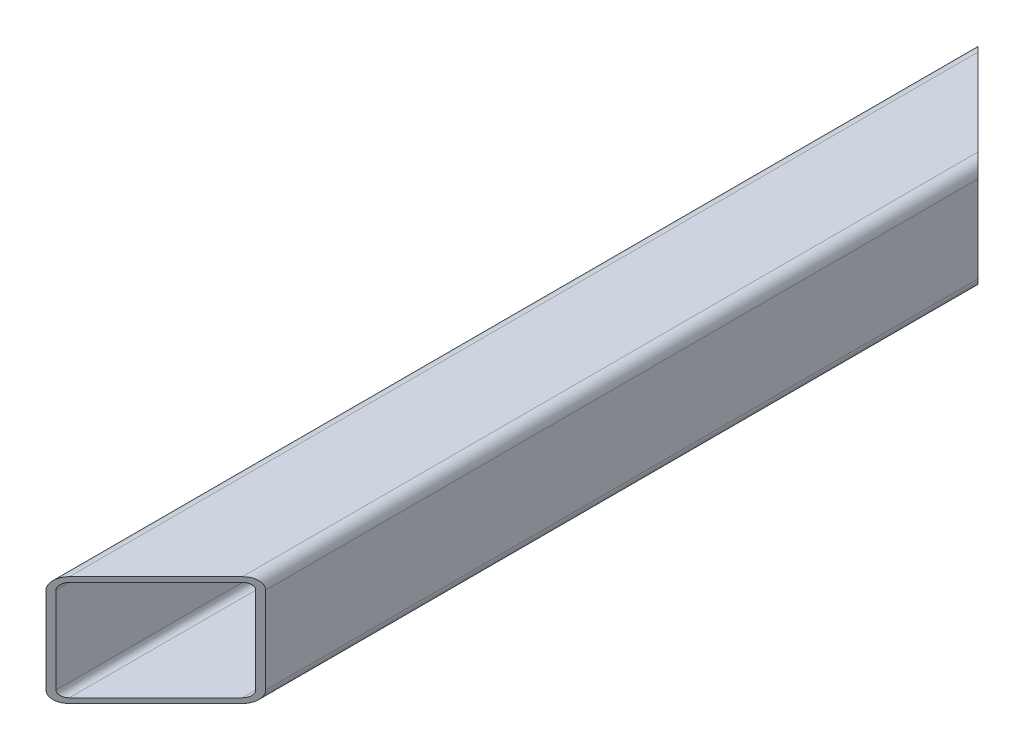
ISO-10303-21;
HEADER;
FILE_DESCRIPTION(('STEP AP214'),'2;1');
FILE_NAME('part.step','',(''),(''),'','','');
FILE_SCHEMA(('AUTOMOTIVE_DESIGN { 1 0 10303 214 1 1 1 1 }'));
ENDSEC;
DATA;
#1=APPLICATION_CONTEXT('core data for automotive mechanical design processes');
#2=APPLICATION_PROTOCOL_DEFINITION('international standard','automotive_design',2000,#1);
#3=PRODUCT_CONTEXT('',#1,'mechanical');
#4=PRODUCT('Part','Part','',(#3));
#5=PRODUCT_RELATED_PRODUCT_CATEGORY('part','',(#4));
#6=PRODUCT_DEFINITION_FORMATION('','',#4);
#7=PRODUCT_DEFINITION_CONTEXT('part definition',#1,'design');
#8=PRODUCT_DEFINITION('design','',#6,#7);
#9=PRODUCT_DEFINITION_SHAPE('','',#8);
#10=(LENGTH_UNIT() NAMED_UNIT(*) SI_UNIT(.MILLI.,.METRE.));
#11=(NAMED_UNIT(*) PLANE_ANGLE_UNIT() SI_UNIT($,.RADIAN.));
#12=(NAMED_UNIT(*) SI_UNIT($,.STERADIAN.) SOLID_ANGLE_UNIT());
#13=UNCERTAINTY_MEASURE_WITH_UNIT(LENGTH_MEASURE(1.E-05),#10,'distance_accuracy_value','');
#14=(GEOMETRIC_REPRESENTATION_CONTEXT(3) GLOBAL_UNCERTAINTY_ASSIGNED_CONTEXT((#13)) GLOBAL_UNIT_ASSIGNED_CONTEXT((#10,
#11,#12)) REPRESENTATION_CONTEXT('',''));
#15=CARTESIAN_POINT('',(0.,0.,0.));
#16=DIRECTION('',(0.,0.,1.));
#17=DIRECTION('',(1.,0.,0.));
#18=AXIS2_PLACEMENT_3D('',#15,#16,#17);
#19=CARTESIAN_POINT('',(28.,2.,280.));
#20=DIRECTION('',(0.,0.,-1.));
#21=DIRECTION('',(-1.,0.,0.));
#22=AXIS2_PLACEMENT_3D('',#19,#20,#21);
#23=CYLINDRICAL_SURFACE('',#22,3.5);
#24=DIRECTION('',(0.,0.,-1.));
#25=VECTOR('',#24,1.);
#26=CARTESIAN_POINT('',(31.5,2.00000000000001,280.));
#27=LINE('',#26,#25);
#28=CARTESIAN_POINT('',(31.5,2.00000000000001,247.));
#29=VERTEX_POINT('',#28);
#30=CARTESIAN_POINT('',(31.5,2.00000000000001,33.));
#31=VERTEX_POINT('',#30);
#32=EDGE_CURVE('E219',#29,#31,#27,.T.);
#33=ORIENTED_EDGE('',*,*,#32,.F.);
#34=CARTESIAN_POINT('',(28.,2.,250.5));
#35=DIRECTION('',(-0.707106781186547,0.,-0.707106781186547));
#36=DIRECTION('',(0.707106781186548,0.,-0.707106781186548));
#37=AXIS2_PLACEMENT_3D('',#34,#35,#36);
#38=ELLIPSE('',#37,4.94974746830583,3.5);
#39=CARTESIAN_POINT('',(28.,-1.5,250.5));
#40=VERTEX_POINT('',#39);
#41=EDGE_CURVE('E201',#29,#40,#38,.T.);
#42=ORIENTED_EDGE('',*,*,#41,.T.);
#43=DIRECTION('',(0.,0.,-1.));
#44=VECTOR('',#43,1.);
#45=CARTESIAN_POINT('',(28.,-1.5,280.));
#46=LINE('',#45,#44);
#47=CARTESIAN_POINT('',(28.,-1.5,29.5));
#48=VERTEX_POINT('',#47);
#49=EDGE_CURVE('E280',#40,#48,#46,.T.);
#50=ORIENTED_EDGE('',*,*,#49,.T.);
#51=CARTESIAN_POINT('',(28.,2.,29.5));
#52=DIRECTION('',(-0.707106781186547,0.,0.707106781186547));
#53=DIRECTION('',(-0.707106781186548,0.,-0.707106781186548));
#54=AXIS2_PLACEMENT_3D('',#51,#52,#53);
#55=ELLIPSE('',#54,4.94974746830583,3.5);
#56=EDGE_CURVE('E260',#48,#31,#55,.T.);
#57=ORIENTED_EDGE('',*,*,#56,.T.);
#58=EDGE_LOOP('',(#33,#42,#50,#57));
#59=FACE_BOUND('',#58,.T.);
#60=ADVANCED_FACE('F82',(#59),#23,.T.);
#61=CARTESIAN_POINT('',(31.5,2.00000000000001,280.));
#62=DIRECTION('',(-1.,0.,0.));
#63=DIRECTION('',(0.,0.,1.));
#64=AXIS2_PLACEMENT_3D('',#61,#62,#63);
#65=PLANE('',#64);
#66=DIRECTION('',(0.,0.,-1.));
#67=VECTOR('',#66,1.);
#68=CARTESIAN_POINT('',(31.5,28.,280.));
#69=LINE('',#68,#67);
#70=CARTESIAN_POINT('',(31.5,28.,247.));
#71=VERTEX_POINT('',#70);
#72=CARTESIAN_POINT('',(31.5,28.,33.));
#73=VERTEX_POINT('',#72);
#74=EDGE_CURVE('E217',#71,#73,#69,.T.);
#75=ORIENTED_EDGE('',*,*,#74,.F.);
#76=DIRECTION('',(0.,1.,0.));
#77=VECTOR('',#76,1.);
#78=CARTESIAN_POINT('',(31.5,-1.5,247.));
#79=LINE('',#78,#77);
#80=EDGE_CURVE('E197',#29,#71,#79,.T.);
#81=ORIENTED_EDGE('',*,*,#80,.F.);
#82=ORIENTED_EDGE('',*,*,#32,.T.);
#83=DIRECTION('',(0.,1.,0.));
#84=VECTOR('',#83,1.);
#85=CARTESIAN_POINT('',(31.5,-1.5,33.));
#86=LINE('',#85,#84);
#87=EDGE_CURVE('E302',#31,#73,#86,.T.);
#88=ORIENTED_EDGE('',*,*,#87,.T.);
#89=EDGE_LOOP('',(#75,#81,#82,#88));
#90=FACE_BOUND('',#89,.T.);
#91=ADVANCED_FACE('F368',(#90),#65,.F.);
#92=CARTESIAN_POINT('',(28.,28.,280.));
#93=DIRECTION('',(0.,0.,-1.));
#94=DIRECTION('',(-1.,0.,0.));
#95=AXIS2_PLACEMENT_3D('',#92,#93,#94);
#96=CYLINDRICAL_SURFACE('',#95,3.5);
#97=DIRECTION('',(0.,0.,-1.));
#98=VECTOR('',#97,1.);
#99=CARTESIAN_POINT('',(28.,31.5,280.));
#100=LINE('',#99,#98);
#101=CARTESIAN_POINT('',(28.,31.5,250.5));
#102=VERTEX_POINT('',#101);
#103=CARTESIAN_POINT('',(28.,31.5,29.5));
#104=VERTEX_POINT('',#103);
#105=EDGE_CURVE('E208',#102,#104,#100,.T.);
#106=ORIENTED_EDGE('',*,*,#105,.F.);
#107=CARTESIAN_POINT('',(28.,28.,250.5));
#108=DIRECTION('',(-0.707106781186547,0.,-0.707106781186547));
#109=DIRECTION('',(0.707106781186548,0.,-0.707106781186548));
#110=AXIS2_PLACEMENT_3D('',#107,#108,#109);
#111=ELLIPSE('',#110,4.94974746830584,3.5);
#112=EDGE_CURVE('E191',#102,#71,#111,.T.);
#113=ORIENTED_EDGE('',*,*,#112,.T.);
#114=ORIENTED_EDGE('',*,*,#74,.T.);
#115=CARTESIAN_POINT('',(28.,28.,29.5));
#116=DIRECTION('',(-0.707106781186547,0.,0.707106781186547));
#117=DIRECTION('',(-0.707106781186548,0.,-0.707106781186548));
#118=AXIS2_PLACEMENT_3D('',#115,#116,#117);
#119=ELLIPSE('',#118,4.94974746830584,3.5);
#120=EDGE_CURVE('E216',#73,#104,#119,.T.);
#121=ORIENTED_EDGE('',*,*,#120,.T.);
#122=EDGE_LOOP('',(#106,#113,#114,#121));
#123=FACE_BOUND('',#122,.T.);
#124=ADVANCED_FACE('F214',(#123),#96,.T.);
#125=CARTESIAN_POINT('',(2.00000000000001,31.5,280.));
#126=DIRECTION('',(0.,-1.,0.));
#127=DIRECTION('',(0.,0.,-1.));
#128=AXIS2_PLACEMENT_3D('',#125,#126,#127);
#129=PLANE('',#128);
#130=DIRECTION('',(0.,0.,-1.));
#131=VECTOR('',#130,1.);
#132=CARTESIAN_POINT('',(2.00000000000001,31.5,280.));
#133=LINE('',#132,#131);
#134=CARTESIAN_POINT('',(2.,31.5,276.5));
#135=VERTEX_POINT('',#134);
#136=CARTESIAN_POINT('',(2.,31.5,3.50000000000001));
#137=VERTEX_POINT('',#136);
#138=EDGE_CURVE('E210',#135,#137,#133,.T.);
#139=ORIENTED_EDGE('',*,*,#138,.F.);
#140=DIRECTION('',(-0.707106781186547,0.,0.707106781186547));
#141=VECTOR('',#140,1.);
#142=CARTESIAN_POINT('',(-1.5,31.5,280.));
#143=LINE('',#142,#141);
#144=EDGE_CURVE('E194',#102,#135,#143,.T.);
#145=ORIENTED_EDGE('',*,*,#144,.F.);
#146=ORIENTED_EDGE('',*,*,#105,.T.);
#147=DIRECTION('',(0.707106781186547,0.,0.707106781186547));
#148=VECTOR('',#147,1.);
#149=CARTESIAN_POINT('',(-1.5,31.5,0.));
#150=LINE('',#149,#148);
#151=EDGE_CURVE('E298',#137,#104,#150,.T.);
#152=ORIENTED_EDGE('',*,*,#151,.F.);
#153=EDGE_LOOP('',(#139,#145,#146,#152));
#154=FACE_BOUND('',#153,.T.);
#155=ADVANCED_FACE('F206',(#154),#129,.F.);
#156=CARTESIAN_POINT('',(2.,28.,280.));
#157=DIRECTION('',(0.,0.,-1.));
#158=DIRECTION('',(-1.,0.,0.));
#159=AXIS2_PLACEMENT_3D('',#156,#157,#158);
#160=CYLINDRICAL_SURFACE('',#159,3.5);
#161=DIRECTION('',(0.,0.,-1.));
#162=VECTOR('',#161,1.);
#163=CARTESIAN_POINT('',(-1.5,28.,280.));
#164=LINE('',#163,#162);
#165=CARTESIAN_POINT('',(-1.5,28.,280.));
#166=VERTEX_POINT('',#165);
#167=CARTESIAN_POINT('',(-1.5,28.,0.));
#168=VERTEX_POINT('',#167);
#169=EDGE_CURVE('E221',#166,#168,#164,.T.);
#170=ORIENTED_EDGE('',*,*,#169,.F.);
#171=CARTESIAN_POINT('',(2.,28.,276.5));
#172=DIRECTION('',(-0.707106781186547,0.,-0.707106781186547));
#173=DIRECTION('',(0.707106781186548,0.,-0.707106781186548));
#174=AXIS2_PLACEMENT_3D('',#171,#172,#173);
#175=ELLIPSE('',#174,4.94974746830583,3.5);
#176=EDGE_CURVE('E202',#166,#135,#175,.T.);
#177=ORIENTED_EDGE('',*,*,#176,.T.);
#178=ORIENTED_EDGE('',*,*,#138,.T.);
#179=CARTESIAN_POINT('',(2.,28.,3.5));
#180=DIRECTION('',(-0.707106781186547,0.,0.707106781186547));
#181=DIRECTION('',(-0.707106781186548,0.,-0.707106781186548));
#182=AXIS2_PLACEMENT_3D('',#179,#180,#181);
#183=ELLIPSE('',#182,4.94974746830583,3.5);
#184=EDGE_CURVE('E251',#137,#168,#183,.T.);
#185=ORIENTED_EDGE('',*,*,#184,.T.);
#186=EDGE_LOOP('',(#170,#177,#178,#185));
#187=FACE_BOUND('',#186,.T.);
#188=ADVANCED_FACE('F295',(#187),#160,.T.);
#189=CARTESIAN_POINT('',(-1.5,2.00000000000001,280.));
#190=DIRECTION('',(1.,0.,0.));
#191=DIRECTION('',(0.,0.,-1.));
#192=AXIS2_PLACEMENT_3D('',#189,#190,#191);
#193=PLANE('',#192);
#194=DIRECTION('',(0.,-1.,0.));
#195=VECTOR('',#194,1.);
#196=CARTESIAN_POINT('',(-1.5,2.00000000000001,0.));
#197=LINE('',#196,#195);
#198=CARTESIAN_POINT('',(-1.5,2.,0.));
#199=VERTEX_POINT('',#198);
#200=EDGE_CURVE('E277',#168,#199,#197,.T.);
#201=ORIENTED_EDGE('',*,*,#200,.T.);
#202=DIRECTION('',(0.,0.,-1.));
#203=VECTOR('',#202,1.);
#204=CARTESIAN_POINT('',(-1.5,2.00000000000001,280.));
#205=LINE('',#204,#203);
#206=CARTESIAN_POINT('',(-1.5,2.,280.));
#207=VERTEX_POINT('',#206);
#208=EDGE_CURVE('E286',#207,#199,#205,.T.);
#209=ORIENTED_EDGE('',*,*,#208,.F.);
#210=DIRECTION('',(0.,-1.,0.));
#211=VECTOR('',#210,1.);
#212=CARTESIAN_POINT('',(-1.5,2.00000000000001,280.));
#213=LINE('',#212,#211);
#214=EDGE_CURVE('E278',#166,#207,#213,.T.);
#215=ORIENTED_EDGE('',*,*,#214,.F.);
#216=ORIENTED_EDGE('',*,*,#169,.T.);
#217=EDGE_LOOP('',(#201,#209,#215,#216));
#218=FACE_BOUND('',#217,.T.);
#219=ADVANCED_FACE('F292',(#218),#193,.F.);
#220=CARTESIAN_POINT('',(2.,2.,280.));
#221=DIRECTION('',(0.,0.,-1.));
#222=DIRECTION('',(-1.,0.,0.));
#223=AXIS2_PLACEMENT_3D('',#220,#221,#222);
#224=CYLINDRICAL_SURFACE('',#223,3.5);
#225=DIRECTION('',(0.,0.,-1.));
#226=VECTOR('',#225,1.);
#227=CARTESIAN_POINT('',(2.00000000000003,-1.5,280.));
#228=LINE('',#227,#226);
#229=CARTESIAN_POINT('',(2.00000000000003,-1.5,276.5));
#230=VERTEX_POINT('',#229);
#231=CARTESIAN_POINT('',(2.00000000000003,-1.5,3.50000000000003));
#232=VERTEX_POINT('',#231);
#233=EDGE_CURVE('E284',#230,#232,#228,.T.);
#234=ORIENTED_EDGE('',*,*,#233,.F.);
#235=CARTESIAN_POINT('',(2.,2.,276.5));
#236=DIRECTION('',(-0.707106781186547,0.,-0.707106781186547));
#237=DIRECTION('',(0.707106781186548,0.,-0.707106781186548));
#238=AXIS2_PLACEMENT_3D('',#235,#236,#237);
#239=ELLIPSE('',#238,4.94974746830583,3.5);
#240=EDGE_CURVE('E96',#230,#207,#239,.T.);
#241=ORIENTED_EDGE('',*,*,#240,.T.);
#242=ORIENTED_EDGE('',*,*,#208,.T.);
#243=CARTESIAN_POINT('',(2.,2.,3.5));
#244=DIRECTION('',(-0.707106781186547,0.,0.707106781186547));
#245=DIRECTION('',(-0.707106781186548,0.,-0.707106781186548));
#246=AXIS2_PLACEMENT_3D('',#243,#244,#245);
#247=ELLIPSE('',#246,4.94974746830583,3.5);
#248=EDGE_CURVE('E247',#199,#232,#247,.T.);
#249=ORIENTED_EDGE('',*,*,#248,.T.);
#250=EDGE_LOOP('',(#234,#241,#242,#249));
#251=FACE_BOUND('',#250,.T.);
#252=ADVANCED_FACE('F359',(#251),#224,.T.);
#253=CARTESIAN_POINT('',(2.00000000000001,-1.5,280.));
#254=DIRECTION('',(0.,1.,0.));
#255=DIRECTION('',(0.,0.,1.));
#256=AXIS2_PLACEMENT_3D('',#253,#254,#255);
#257=PLANE('',#256);
#258=ORIENTED_EDGE('',*,*,#49,.F.);
#259=DIRECTION('',(-0.707106781186547,0.,0.707106781186547));
#260=VECTOR('',#259,1.);
#261=CARTESIAN_POINT('',(-1.5,-1.5,280.));
#262=LINE('',#261,#260);
#263=EDGE_CURVE('E211',#40,#230,#262,.T.);
#264=ORIENTED_EDGE('',*,*,#263,.T.);
#265=ORIENTED_EDGE('',*,*,#233,.T.);
#266=DIRECTION('',(0.707106781186547,0.,0.707106781186547));
#267=VECTOR('',#266,1.);
#268=CARTESIAN_POINT('',(-1.5,-1.5,0.));
#269=LINE('',#268,#267);
#270=EDGE_CURVE('E299',#232,#48,#269,.T.);
#271=ORIENTED_EDGE('',*,*,#270,.T.);
#272=EDGE_LOOP('',(#258,#264,#265,#271));
#273=FACE_BOUND('',#272,.T.);
#274=ADVANCED_FACE('F362',(#273),#257,.F.);
#275=CARTESIAN_POINT('',(28.,2.,280.));
#276=DIRECTION('',(0.,0.,-1.));
#277=DIRECTION('',(-1.,0.,0.));
#278=AXIS2_PLACEMENT_3D('',#275,#276,#277);
#279=CYLINDRICAL_SURFACE('',#278,2.);
#280=CARTESIAN_POINT('',(28.,2.,250.5));
#281=DIRECTION('',(-0.707106781186547,0.,-0.707106781186547));
#282=DIRECTION('',(0.707106781186548,0.,-0.707106781186548));
#283=AXIS2_PLACEMENT_3D('',#280,#281,#282);
#284=ELLIPSE('',#283,2.82842712474619,2.);
#285=CARTESIAN_POINT('',(30.,2.00000000000001,248.5));
#286=VERTEX_POINT('',#285);
#287=CARTESIAN_POINT('',(28.,0.,250.5));
#288=VERTEX_POINT('',#287);
#289=EDGE_CURVE('E103',#286,#288,#284,.T.);
#290=ORIENTED_EDGE('',*,*,#289,.F.);
#291=DIRECTION('',(0.,0.,-1.));
#292=VECTOR('',#291,1.);
#293=CARTESIAN_POINT('',(30.,2.00000000000001,280.));
#294=LINE('',#293,#292);
#295=CARTESIAN_POINT('',(30.,2.00000000000001,31.5));
#296=VERTEX_POINT('',#295);
#297=EDGE_CURVE('E246',#286,#296,#294,.T.);
#298=ORIENTED_EDGE('',*,*,#297,.T.);
#299=CARTESIAN_POINT('',(28.,2.,29.5));
#300=DIRECTION('',(-0.707106781186547,0.,0.707106781186547));
#301=DIRECTION('',(-0.707106781186548,0.,-0.707106781186548));
#302=AXIS2_PLACEMENT_3D('',#299,#300,#301);
#303=ELLIPSE('',#302,2.82842712474619,2.);
#304=CARTESIAN_POINT('',(28.,0.,29.5));
#305=VERTEX_POINT('',#304);
#306=EDGE_CURVE('E234',#305,#296,#303,.T.);
#307=ORIENTED_EDGE('',*,*,#306,.F.);
#308=DIRECTION('',(0.,0.,-1.));
#309=VECTOR('',#308,1.);
#310=CARTESIAN_POINT('',(28.,0.,280.));
#311=LINE('',#310,#309);
#312=EDGE_CURVE('E244',#288,#305,#311,.T.);
#313=ORIENTED_EDGE('',*,*,#312,.F.);
#314=EDGE_LOOP('',(#290,#298,#307,#313));
#315=FACE_BOUND('',#314,.T.);
#316=ADVANCED_FACE('F243',(#315),#279,.F.);
#317=CARTESIAN_POINT('',(30.,2.00000000000001,280.));
#318=DIRECTION('',(-1.,0.,0.));
#319=DIRECTION('',(0.,0.,1.));
#320=AXIS2_PLACEMENT_3D('',#317,#318,#319);
#321=PLANE('',#320);
#322=DIRECTION('',(0.,-1.,0.));
#323=VECTOR('',#322,1.);
#324=CARTESIAN_POINT('',(30.,2.00000000000001,248.5));
#325=LINE('',#324,#323);
#326=CARTESIAN_POINT('',(30.,28.,248.5));
#327=VERTEX_POINT('',#326);
#328=EDGE_CURVE('E353',#327,#286,#325,.T.);
#329=ORIENTED_EDGE('',*,*,#328,.F.);
#330=DIRECTION('',(0.,0.,-1.));
#331=VECTOR('',#330,1.);
#332=CARTESIAN_POINT('',(30.,28.,280.));
#333=LINE('',#332,#331);
#334=CARTESIAN_POINT('',(30.,28.,31.5));
#335=VERTEX_POINT('',#334);
#336=EDGE_CURVE('E274',#327,#335,#333,.T.);
#337=ORIENTED_EDGE('',*,*,#336,.T.);
#338=DIRECTION('',(0.,1.,0.));
#339=VECTOR('',#338,1.);
#340=CARTESIAN_POINT('',(30.,2.00000000000001,31.5));
#341=LINE('',#340,#339);
#342=EDGE_CURVE('E248',#296,#335,#341,.T.);
#343=ORIENTED_EDGE('',*,*,#342,.F.);
#344=ORIENTED_EDGE('',*,*,#297,.F.);
#345=EDGE_LOOP('',(#329,#337,#343,#344));
#346=FACE_BOUND('',#345,.T.);
#347=ADVANCED_FACE('F388',(#346),#321,.T.);
#348=CARTESIAN_POINT('',(28.,28.,280.));
#349=DIRECTION('',(0.,0.,-1.));
#350=DIRECTION('',(-1.,0.,0.));
#351=AXIS2_PLACEMENT_3D('',#348,#349,#350);
#352=CYLINDRICAL_SURFACE('',#351,2.);
#353=CARTESIAN_POINT('',(28.,28.,250.5));
#354=DIRECTION('',(-0.707106781186547,0.,-0.707106781186547));
#355=DIRECTION('',(0.707106781186548,0.,-0.707106781186548));
#356=AXIS2_PLACEMENT_3D('',#353,#354,#355);
#357=ELLIPSE('',#356,2.82842712474619,2.);
#358=CARTESIAN_POINT('',(28.,30.,250.5));
#359=VERTEX_POINT('',#358);
#360=EDGE_CURVE('E351',#359,#327,#357,.T.);
#361=ORIENTED_EDGE('',*,*,#360,.F.);
#362=DIRECTION('',(0.,0.,-1.));
#363=VECTOR('',#362,1.);
#364=CARTESIAN_POINT('',(28.,30.,280.));
#365=LINE('',#364,#363);
#366=CARTESIAN_POINT('',(28.,30.,29.5));
#367=VERTEX_POINT('',#366);
#368=EDGE_CURVE('E272',#359,#367,#365,.T.);
#369=ORIENTED_EDGE('',*,*,#368,.T.);
#370=CARTESIAN_POINT('',(28.,28.,29.5));
#371=DIRECTION('',(-0.707106781186547,0.,0.707106781186547));
#372=DIRECTION('',(-0.707106781186548,0.,-0.707106781186548));
#373=AXIS2_PLACEMENT_3D('',#370,#371,#372);
#374=ELLIPSE('',#373,2.82842712474619,2.);
#375=EDGE_CURVE('E253',#335,#367,#374,.T.);
#376=ORIENTED_EDGE('',*,*,#375,.F.);
#377=ORIENTED_EDGE('',*,*,#336,.F.);
#378=EDGE_LOOP('',(#361,#369,#376,#377));
#379=FACE_BOUND('',#378,.T.);
#380=ADVANCED_FACE('F391',(#379),#352,.F.);
#381=CARTESIAN_POINT('',(2.00000000000001,30.,280.));
#382=DIRECTION('',(0.,-1.,0.));
#383=DIRECTION('',(0.,0.,-1.));
#384=AXIS2_PLACEMENT_3D('',#381,#382,#383);
#385=PLANE('',#384);
#386=DIRECTION('',(0.707106781186548,0.,-0.707106781186548));
#387=VECTOR('',#386,1.);
#388=CARTESIAN_POINT('',(0.250000000000007,30.,278.25));
#389=LINE('',#388,#387);
#390=CARTESIAN_POINT('',(2.00000000000001,30.,276.5));
#391=VERTEX_POINT('',#390);
#392=EDGE_CURVE('E328',#391,#359,#389,.T.);
#393=ORIENTED_EDGE('',*,*,#392,.F.);
#394=DIRECTION('',(0.,0.,-1.));
#395=VECTOR('',#394,1.);
#396=CARTESIAN_POINT('',(2.00000000000001,30.,280.));
#397=LINE('',#396,#395);
#398=CARTESIAN_POINT('',(2.00000000000001,30.,3.5));
#399=VERTEX_POINT('',#398);
#400=EDGE_CURVE('E270',#391,#399,#397,.T.);
#401=ORIENTED_EDGE('',*,*,#400,.T.);
#402=DIRECTION('',(-0.707106781186548,0.,-0.707106781186548));
#403=VECTOR('',#402,1.);
#404=CARTESIAN_POINT('',(140.25,30.,141.75));
#405=LINE('',#404,#403);
#406=EDGE_CURVE('E315',#367,#399,#405,.T.);
#407=ORIENTED_EDGE('',*,*,#406,.F.);
#408=ORIENTED_EDGE('',*,*,#368,.F.);
#409=EDGE_LOOP('',(#393,#401,#407,#408));
#410=FACE_BOUND('',#409,.T.);
#411=ADVANCED_FACE('F326',(#410),#385,.T.);
#412=CARTESIAN_POINT('',(2.,28.,280.));
#413=DIRECTION('',(0.,0.,-1.));
#414=DIRECTION('',(-1.,0.,0.));
#415=AXIS2_PLACEMENT_3D('',#412,#413,#414);
#416=CYLINDRICAL_SURFACE('',#415,2.);
#417=CARTESIAN_POINT('',(2.,28.,276.5));
#418=DIRECTION('',(-0.707106781186547,0.,-0.707106781186547));
#419=DIRECTION('',(0.707106781186548,0.,-0.707106781186548));
#420=AXIS2_PLACEMENT_3D('',#417,#418,#419);
#421=ELLIPSE('',#420,2.82842712474619,2.);
#422=CARTESIAN_POINT('',(0.,28.,278.5));
#423=VERTEX_POINT('',#422);
#424=EDGE_CURVE('E332',#423,#391,#421,.T.);
#425=ORIENTED_EDGE('',*,*,#424,.F.);
#426=DIRECTION('',(0.,0.,-1.));
#427=VECTOR('',#426,1.);
#428=CARTESIAN_POINT('',(0.,28.,280.));
#429=LINE('',#428,#427);
#430=CARTESIAN_POINT('',(0.,28.,1.5));
#431=VERTEX_POINT('',#430);
#432=EDGE_CURVE('E268',#423,#431,#429,.T.);
#433=ORIENTED_EDGE('',*,*,#432,.T.);
#434=CARTESIAN_POINT('',(2.,28.,3.5));
#435=DIRECTION('',(-0.707106781186547,0.,0.707106781186547));
#436=DIRECTION('',(-0.707106781186548,0.,-0.707106781186548));
#437=AXIS2_PLACEMENT_3D('',#434,#435,#436);
#438=ELLIPSE('',#437,2.82842712474619,2.);
#439=EDGE_CURVE('E312',#399,#431,#438,.T.);
#440=ORIENTED_EDGE('',*,*,#439,.F.);
#441=ORIENTED_EDGE('',*,*,#400,.F.);
#442=EDGE_LOOP('',(#425,#433,#440,#441));
#443=FACE_BOUND('',#442,.T.);
#444=ADVANCED_FACE('F331',(#443),#416,.F.);
#445=CARTESIAN_POINT('',(0.,2.00000000000001,280.));
#446=DIRECTION('',(1.,0.,0.));
#447=DIRECTION('',(0.,0.,-1.));
#448=AXIS2_PLACEMENT_3D('',#445,#446,#447);
#449=PLANE('',#448);
#450=DIRECTION('',(0.,1.,0.));
#451=VECTOR('',#450,1.);
#452=CARTESIAN_POINT('',(0.,2.00000000000001,278.5));
#453=LINE('',#452,#451);
#454=CARTESIAN_POINT('',(0.,2.00000000000001,278.5));
#455=VERTEX_POINT('',#454);
#456=EDGE_CURVE('E339',#455,#423,#453,.T.);
#457=ORIENTED_EDGE('',*,*,#456,.F.);
#458=DIRECTION('',(0.,0.,-1.));
#459=VECTOR('',#458,1.);
#460=CARTESIAN_POINT('',(0.,2.00000000000001,280.));
#461=LINE('',#460,#459);
#462=CARTESIAN_POINT('',(0.,2.00000000000001,1.5));
#463=VERTEX_POINT('',#462);
#464=EDGE_CURVE('E266',#455,#463,#461,.T.);
#465=ORIENTED_EDGE('',*,*,#464,.T.);
#466=DIRECTION('',(0.,-1.,0.));
#467=VECTOR('',#466,1.);
#468=CARTESIAN_POINT('',(0.,2.00000000000001,1.5));
#469=LINE('',#468,#467);
#470=EDGE_CURVE('E310',#431,#463,#469,.T.);
#471=ORIENTED_EDGE('',*,*,#470,.F.);
#472=ORIENTED_EDGE('',*,*,#432,.F.);
#473=EDGE_LOOP('',(#457,#465,#471,#472));
#474=FACE_BOUND('',#473,.T.);
#475=ADVANCED_FACE('F337',(#474),#449,.T.);
#476=CARTESIAN_POINT('',(2.,2.,280.));
#477=DIRECTION('',(0.,0.,-1.));
#478=DIRECTION('',(-1.,0.,0.));
#479=AXIS2_PLACEMENT_3D('',#476,#477,#478);
#480=CYLINDRICAL_SURFACE('',#479,2.);
#481=CARTESIAN_POINT('',(2.,2.,276.5));
#482=DIRECTION('',(-0.707106781186547,0.,-0.707106781186547));
#483=DIRECTION('',(0.707106781186548,0.,-0.707106781186548));
#484=AXIS2_PLACEMENT_3D('',#481,#482,#483);
#485=ELLIPSE('',#484,2.82842712474619,2.);
#486=CARTESIAN_POINT('',(2.00000000000001,0.,276.5));
#487=VERTEX_POINT('',#486);
#488=EDGE_CURVE('E343',#487,#455,#485,.T.);
#489=ORIENTED_EDGE('',*,*,#488,.F.);
#490=DIRECTION('',(0.,0.,-1.));
#491=VECTOR('',#490,1.);
#492=CARTESIAN_POINT('',(2.00000000000001,0.,280.));
#493=LINE('',#492,#491);
#494=CARTESIAN_POINT('',(2.00000000000001,0.,3.50000000000003));
#495=VERTEX_POINT('',#494);
#496=EDGE_CURVE('E264',#487,#495,#493,.T.);
#497=ORIENTED_EDGE('',*,*,#496,.T.);
#498=CARTESIAN_POINT('',(2.,2.,3.5));
#499=DIRECTION('',(-0.707106781186547,0.,0.707106781186547));
#500=DIRECTION('',(-0.707106781186548,0.,-0.707106781186548));
#501=AXIS2_PLACEMENT_3D('',#498,#499,#500);
#502=ELLIPSE('',#501,2.82842712474619,2.);
#503=EDGE_CURVE('E238',#463,#495,#502,.T.);
#504=ORIENTED_EDGE('',*,*,#503,.F.);
#505=ORIENTED_EDGE('',*,*,#464,.F.);
#506=EDGE_LOOP('',(#489,#497,#504,#505));
#507=FACE_BOUND('',#506,.T.);
#508=ADVANCED_FACE('F342',(#507),#480,.F.);
#509=CARTESIAN_POINT('',(2.00000000000001,0.,280.));
#510=DIRECTION('',(0.,1.,0.));
#511=DIRECTION('',(0.,0.,1.));
#512=AXIS2_PLACEMENT_3D('',#509,#510,#511);
#513=PLANE('',#512);
#514=DIRECTION('',(-0.707106781186548,0.,0.707106781186548));
#515=VECTOR('',#514,1.);
#516=CARTESIAN_POINT('',(0.250000000000007,0.,278.25));
#517=LINE('',#516,#515);
#518=EDGE_CURVE('E12',#288,#487,#517,.T.);
#519=ORIENTED_EDGE('',*,*,#518,.F.);
#520=ORIENTED_EDGE('',*,*,#312,.T.);
#521=DIRECTION('',(0.707106781186548,0.,0.707106781186548));
#522=VECTOR('',#521,1.);
#523=CARTESIAN_POINT('',(140.25,0.,141.75));
#524=LINE('',#523,#522);
#525=EDGE_CURVE('E89',#495,#305,#524,.T.);
#526=ORIENTED_EDGE('',*,*,#525,.F.);
#527=ORIENTED_EDGE('',*,*,#496,.F.);
#528=EDGE_LOOP('',(#519,#520,#526,#527));
#529=FACE_BOUND('',#528,.T.);
#530=ADVANCED_FACE('F344',(#529),#513,.T.);
#531=CARTESIAN_POINT('',(-1.5,-1.5,0.));
#532=DIRECTION('',(-0.707106781186547,0.,0.707106781186547));
#533=DIRECTION('',(0.707106781186548,0.,0.707106781186548));
#534=AXIS2_PLACEMENT_3D('',#531,#532,#533);
#535=PLANE('',#534);
#536=ORIENTED_EDGE('',*,*,#306,.T.);
#537=ORIENTED_EDGE('',*,*,#342,.T.);
#538=ORIENTED_EDGE('',*,*,#375,.T.);
#539=ORIENTED_EDGE('',*,*,#406,.T.);
#540=ORIENTED_EDGE('',*,*,#439,.T.);
#541=ORIENTED_EDGE('',*,*,#470,.T.);
#542=ORIENTED_EDGE('',*,*,#503,.T.);
#543=ORIENTED_EDGE('',*,*,#525,.T.);
#544=EDGE_LOOP('',(#536,#537,#538,#539,#540,#541,#542,#543));
#545=FACE_BOUND('',#544,.T.);
#546=ORIENTED_EDGE('',*,*,#270,.F.);
#547=ORIENTED_EDGE('',*,*,#248,.F.);
#548=ORIENTED_EDGE('',*,*,#200,.F.);
#549=ORIENTED_EDGE('',*,*,#184,.F.);
#550=ORIENTED_EDGE('',*,*,#151,.T.);
#551=ORIENTED_EDGE('',*,*,#120,.F.);
#552=ORIENTED_EDGE('',*,*,#87,.F.);
#553=ORIENTED_EDGE('',*,*,#56,.F.);
#554=EDGE_LOOP('',(#546,#547,#548,#549,#550,#551,#552,#553));
#555=FACE_BOUND('',#554,.T.);
#556=ADVANCED_FACE('F231',(#545,#555),#535,.F.);
#557=CARTESIAN_POINT('',(-1.5,-1.5,280.));
#558=DIRECTION('',(-0.707106781186547,0.,-0.707106781186547));
#559=DIRECTION('',(-0.707106781186548,0.,0.707106781186548));
#560=AXIS2_PLACEMENT_3D('',#557,#558,#559);
#561=PLANE('',#560);
#562=ORIENTED_EDGE('',*,*,#289,.T.);
#563=ORIENTED_EDGE('',*,*,#518,.T.);
#564=ORIENTED_EDGE('',*,*,#488,.T.);
#565=ORIENTED_EDGE('',*,*,#456,.T.);
#566=ORIENTED_EDGE('',*,*,#424,.T.);
#567=ORIENTED_EDGE('',*,*,#392,.T.);
#568=ORIENTED_EDGE('',*,*,#360,.T.);
#569=ORIENTED_EDGE('',*,*,#328,.T.);
#570=EDGE_LOOP('',(#562,#563,#564,#565,#566,#567,#568,#569));
#571=FACE_BOUND('',#570,.T.);
#572=ORIENTED_EDGE('',*,*,#80,.T.);
#573=ORIENTED_EDGE('',*,*,#112,.F.);
#574=ORIENTED_EDGE('',*,*,#144,.T.);
#575=ORIENTED_EDGE('',*,*,#176,.F.);
#576=ORIENTED_EDGE('',*,*,#214,.T.);
#577=ORIENTED_EDGE('',*,*,#240,.F.);
#578=ORIENTED_EDGE('',*,*,#263,.F.);
#579=ORIENTED_EDGE('',*,*,#41,.F.);
#580=EDGE_LOOP('',(#572,#573,#574,#575,#576,#577,#578,#579));
#581=FACE_BOUND('',#580,.T.);
#582=ADVANCED_FACE('F193',(#571,#581),#561,.F.);
#583=CLOSED_SHELL('',(#60,#91,#124,#155,#188,#219,#252,#274,#316,#347,#380,#411,#444,#475,#508,
#530,#556,#582));
#584=MANIFOLD_SOLID_BREP('B2',#583);
#585=ADVANCED_BREP_SHAPE_REPRESENTATION('',(#18,#584),#14);
#586=SHAPE_DEFINITION_REPRESENTATION(#9,#585);
ENDSEC;
END-ISO-10303-21;
